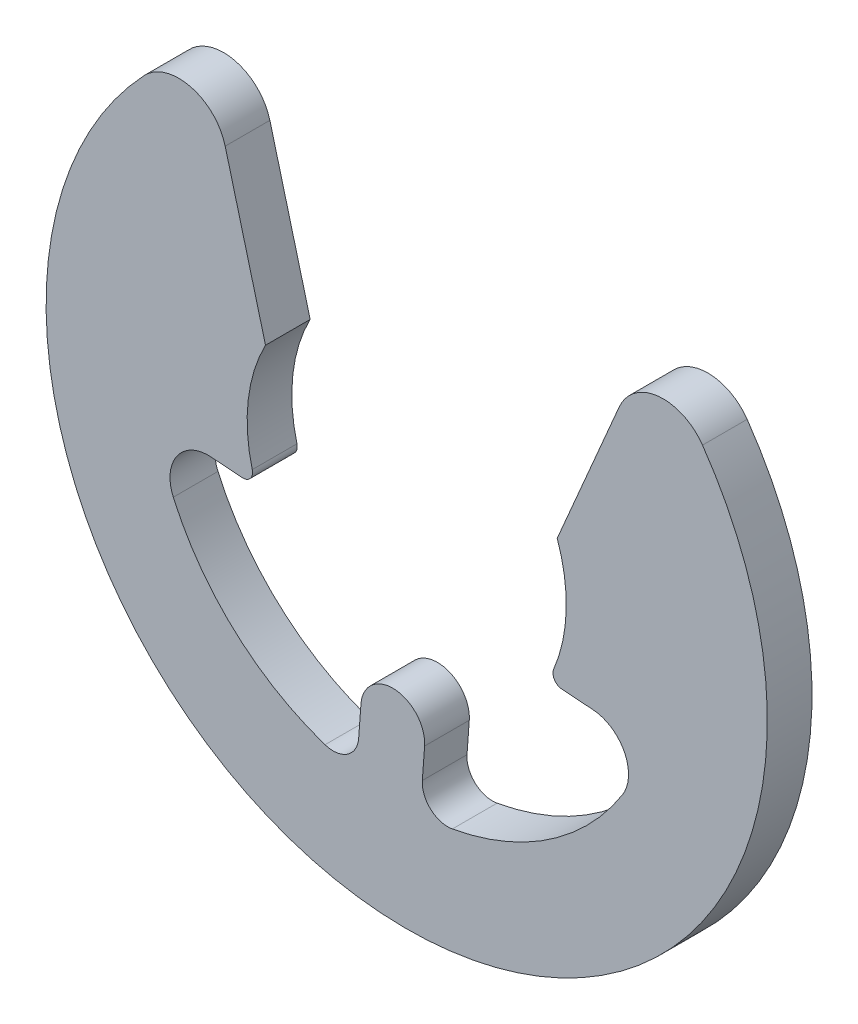
ISO-10303-21;
HEADER;
FILE_DESCRIPTION(('STEP AP214'),'2;1');
FILE_NAME('part.step','',(''),(''),'','','');
FILE_SCHEMA(('AUTOMOTIVE_DESIGN { 1 0 10303 214 1 1 1 1 }'));
ENDSEC;
DATA;
#1=APPLICATION_CONTEXT('core data for automotive mechanical design processes');
#2=APPLICATION_PROTOCOL_DEFINITION('international standard','automotive_design',2000,#1);
#3=PRODUCT_CONTEXT('',#1,'mechanical');
#4=PRODUCT('Part','Part','',(#3));
#5=PRODUCT_RELATED_PRODUCT_CATEGORY('part','',(#4));
#6=PRODUCT_DEFINITION_FORMATION('','',#4);
#7=PRODUCT_DEFINITION_CONTEXT('part definition',#1,'design');
#8=PRODUCT_DEFINITION('design','',#6,#7);
#9=PRODUCT_DEFINITION_SHAPE('','',#8);
#10=(LENGTH_UNIT() NAMED_UNIT(*) SI_UNIT(.MILLI.,.METRE.));
#11=(NAMED_UNIT(*) PLANE_ANGLE_UNIT() SI_UNIT($,.RADIAN.));
#12=(NAMED_UNIT(*) SI_UNIT($,.STERADIAN.) SOLID_ANGLE_UNIT());
#13=UNCERTAINTY_MEASURE_WITH_UNIT(LENGTH_MEASURE(1.E-05),#10,'distance_accuracy_value','');
#14=(GEOMETRIC_REPRESENTATION_CONTEXT(3) GLOBAL_UNCERTAINTY_ASSIGNED_CONTEXT((#13)) GLOBAL_UNIT_ASSIGNED_CONTEXT((#10,
#11,#12)) REPRESENTATION_CONTEXT('',''));
#15=CARTESIAN_POINT('',(0.,0.,0.));
#16=DIRECTION('',(0.,0.,1.));
#17=DIRECTION('',(1.,0.,0.));
#18=AXIS2_PLACEMENT_3D('',#15,#16,#17);
#19=CARTESIAN_POINT('',(-0.0874417235941766,5.80301523383279,-4.84999999999999));
#20=DIRECTION('',(0.,0.,1.));
#21=DIRECTION('',(0.,-1.,0.));
#22=AXIS2_PLACEMENT_3D('',#19,#20,#21);
#23=PLANE('',#22);
#24=CARTESIAN_POINT('',(0.,7.,-4.84999999999999));
#25=DIRECTION('',(0.,0.,1.));
#26=DIRECTION('',(0.,-1.,0.));
#27=AXIS2_PLACEMENT_3D('',#24,#25,#26);
#28=CIRCLE('',#27,2.5);
#29=CARTESIAN_POINT('',(-2.420036172523,6.37276406059581,-4.84999999999999));
#30=VERTEX_POINT('',#29);
#31=CARTESIAN_POINT('',(-2.21234091420949,8.16427989732485,-4.85));
#32=VERTEX_POINT('',#31);
#33=EDGE_CURVE('E175',#30,#32,#28,.F.);
#34=ORIENTED_EDGE('',*,*,#33,.T.);
#35=DIRECTION('',(-0.256010902711158,0.966673894182013,0.));
#36=VECTOR('',#35,1.);
#37=CARTESIAN_POINT('',(-2.84401048965368,10.5494067878771,-4.85));
#38=LINE('',#37,#36);
#39=CARTESIAN_POINT('',(-2.84401048965367,10.5494067878771,-4.85));
#40=VERTEX_POINT('',#39);
#41=EDGE_CURVE('E156',#40,#32,#38,.F.);
#42=ORIENTED_EDGE('',*,*,#41,.F.);
#43=CARTESIAN_POINT('',(-3.56901591029018,10.3573986108437,-4.85));
#44=DIRECTION('',(0.,0.,1.));
#45=DIRECTION('',(1.,0.,0.));
#46=AXIS2_PLACEMENT_3D('',#43,#44,#45);
#47=CIRCLE('',#46,0.750000000000001);
#48=CARTESIAN_POINT('',(-4.11529385574276,10.8712861533198,-4.85));
#49=VERTEX_POINT('',#48);
#50=EDGE_CURVE('E19',#40,#49,#47,.T.);
#51=ORIENTED_EDGE('',*,*,#50,.T.);
#52=CARTESIAN_POINT('',(0.,7.,-4.84999999999999));
#53=DIRECTION('',(0.,0.,1.));
#54=DIRECTION('',(0.,-1.,0.));
#55=AXIS2_PLACEMENT_3D('',#52,#53,#54);
#56=CIRCLE('',#55,5.65);
#57=CARTESIAN_POINT('',(4.63420949373596,10.2321204136244,-4.84999999999999));
#58=VERTEX_POINT('',#57);
#59=EDGE_CURVE('E154',#58,#49,#56,.F.);
#60=ORIENTED_EDGE('',*,*,#59,.F.);
#61=CARTESIAN_POINT('',(4.01904894147012,9.80307788084239,-4.84999999999999));
#62=DIRECTION('',(0.,0.,1.));
#63=DIRECTION('',(1.,0.,0.));
#64=AXIS2_PLACEMENT_3D('',#61,#62,#63);
#65=CIRCLE('',#64,0.750000000000001);
#66=CARTESIAN_POINT('',(3.32964461399444,10.0984110372231,-4.84999999999999));
#67=VERTEX_POINT('',#66);
#68=EDGE_CURVE('E163',#67,#58,#65,.F.);
#69=ORIENTED_EDGE('',*,*,#68,.F.);
#70=DIRECTION('',(-0.393777541840974,-0.919205769967574,0.));
#71=VECTOR('',#70,1.);
#72=CARTESIAN_POINT('',(2.3580559431995,7.83040482220513,-4.84999999999999));
#73=LINE('',#72,#71);
#74=CARTESIAN_POINT('',(2.3580559431995,7.83040482220513,-4.84999999999999));
#75=VERTEX_POINT('',#74);
#76=EDGE_CURVE('E227',#75,#67,#73,.F.);
#77=ORIENTED_EDGE('',*,*,#76,.F.);
#78=CARTESIAN_POINT('',(0.,7.,-4.84999999999999));
#79=DIRECTION('',(0.,0.,1.));
#80=DIRECTION('',(0.,-1.,0.));
#81=AXIS2_PLACEMENT_3D('',#78,#79,#80);
#82=CIRCLE('',#81,2.5);
#83=CARTESIAN_POINT('',(2.30318921531402,6.02772460770561,-4.84999999999999));
#84=VERTEX_POINT('',#83);
#85=EDGE_CURVE('E224',#75,#84,#82,.F.);
#86=ORIENTED_EDGE('',*,*,#85,.T.);
#87=CARTESIAN_POINT('',(2.44138056823286,5.96938808416795,-4.84999999999999));
#88=DIRECTION('',(0.,0.,1.));
#89=DIRECTION('',(1.,0.,0.));
#90=AXIS2_PLACEMENT_3D('',#87,#88,#89);
#91=CIRCLE('',#90,0.15);
#92=CARTESIAN_POINT('',(2.43045194105861,5.8197867302032,-4.84999999999999));
#93=VERTEX_POINT('',#92);
#94=EDGE_CURVE('E220',#93,#84,#91,.F.);
#95=ORIENTED_EDGE('',*,*,#94,.F.);
#96=DIRECTION('',(0.997342359764995,-0.0728575144950101,0.));
#97=VECTOR('',#96,1.);
#98=CARTESIAN_POINT('',(2.91916956479998,5.78408509674997,-4.84999999999999));
#99=LINE('',#98,#97);
#100=CARTESIAN_POINT('',(2.91916956479998,5.78408509674997,-4.84999999999999));
#101=VERTEX_POINT('',#100);
#102=EDGE_CURVE('E217',#101,#93,#99,.F.);
#103=ORIENTED_EDGE('',*,*,#102,.F.);
#104=CARTESIAN_POINT('',(2.87545505610297,5.18567968089097,-4.84999999999999));
#105=DIRECTION('',(0.,0.,1.));
#106=DIRECTION('',(1.,0.,0.));
#107=AXIS2_PLACEMENT_3D('',#104,#105,#106);
#108=CIRCLE('',#107,0.6);
#109=CARTESIAN_POINT('',(3.38288830129761,4.86550550693056,-4.84999999999999));
#110=VERTEX_POINT('',#109);
#111=EDGE_CURVE('E214',#101,#110,#108,.F.);
#112=ORIENTED_EDGE('',*,*,#111,.T.);
#113=CARTESIAN_POINT('',(0.,7.,-4.84999999999999));
#114=DIRECTION('',(0.,0.,1.));
#115=DIRECTION('',(0.,-1.,0.));
#116=AXIS2_PLACEMENT_3D('',#113,#114,#115);
#117=CIRCLE('',#116,4.);
#118=CARTESIAN_POINT('',(0.715166419479756,3.06445213566796,-4.84999999999999));
#119=VERTEX_POINT('',#118);
#120=EDGE_CURVE('E210',#110,#119,#117,.F.);
#121=ORIENTED_EDGE('',*,*,#120,.T.);
#122=CARTESIAN_POINT('',(0.64364977753178,3.45800692210116,-4.84999999999999));
#123=DIRECTION('',(0.,0.,1.));
#124=DIRECTION('',(1.,0.,0.));
#125=AXIS2_PLACEMENT_3D('',#122,#123,#124);
#126=CIRCLE('',#125,0.4);
#127=CARTESIAN_POINT('',(0.244712833625782,3.48714992789916,-4.84999999999999));
#128=VERTEX_POINT('',#127);
#129=EDGE_CURVE('E206',#119,#128,#126,.F.);
#130=ORIENTED_EDGE('',*,*,#129,.T.);
#131=DIRECTION('',(0.0728575144950101,0.997342359764995,0.));
#132=VECTOR('',#131,1.);
#133=CARTESIAN_POINT('',(0.280098636397467,3.9715441634575,-4.84999999999999));
#134=LINE('',#133,#132);
#135=CARTESIAN_POINT('',(0.280098636397467,3.97154416345751,-4.84999999999999));
#136=VERTEX_POINT('',#135);
#137=EDGE_CURVE('E202',#136,#128,#134,.F.);
#138=ORIENTED_EDGE('',*,*,#137,.F.);
#139=CARTESIAN_POINT('',(-0.218572543485031,4.00797292070501,-4.84999999999999));
#140=DIRECTION('',(0.,0.,1.));
#141=DIRECTION('',(1.,0.,0.));
#142=AXIS2_PLACEMENT_3D('',#139,#140,#141);
#143=CIRCLE('',#142,0.5);
#144=CARTESIAN_POINT('',(-0.717243723367528,4.04440167795252,-4.84999999999999));
#145=VERTEX_POINT('',#144);
#146=EDGE_CURVE('E199',#145,#136,#143,.F.);
#147=ORIENTED_EDGE('',*,*,#146,.F.);
#148=DIRECTION('',(-0.0728575144950101,-0.997342359764995,0.));
#149=VECTOR('',#148,1.);
#150=CARTESIAN_POINT('',(-0.752629526139214,3.56000744239417,-4.84999999999999));
#151=LINE('',#150,#149);
#152=CARTESIAN_POINT('',(-0.752629526139213,3.56000744239417,-4.84999999999999));
#153=VERTEX_POINT('',#152);
#154=EDGE_CURVE('E196',#153,#145,#151,.F.);
#155=ORIENTED_EDGE('',*,*,#154,.F.);
#156=CARTESIAN_POINT('',(-1.15156647004521,3.58915044819218,-4.84999999999999));
#157=DIRECTION('',(0.,0.,1.));
#158=DIRECTION('',(1.,0.,0.));
#159=AXIS2_PLACEMENT_3D('',#156,#157,#158);
#160=CIRCLE('',#159,0.4);
#161=CARTESIAN_POINT('',(-1.27951830005023,3.21016716465798,-4.84999999999999));
#162=VERTEX_POINT('',#161);
#163=EDGE_CURVE('E193',#153,#162,#160,.F.);
#164=ORIENTED_EDGE('',*,*,#163,.T.);
#165=CARTESIAN_POINT('',(0.,7.,-4.84999999999999));
#166=DIRECTION('',(0.,0.,1.));
#167=DIRECTION('',(0.,-1.,0.));
#168=AXIS2_PLACEMENT_3D('',#165,#166,#167);
#169=CIRCLE('',#168,4.);
#170=CARTESIAN_POINT('',(-3.65717541469059,5.37979384454239,-4.84999999999999));
#171=VERTEX_POINT('',#170);
#172=EDGE_CURVE('E189',#162,#171,#169,.F.);
#173=ORIENTED_EDGE('',*,*,#172,.T.);
#174=CARTESIAN_POINT('',(-3.108599102487,5.62282476786103,-4.84999999999999));
#175=DIRECTION('',(0.,0.,1.));
#176=DIRECTION('',(1.,0.,0.));
#177=AXIS2_PLACEMENT_3D('',#174,#175,#176);
#178=CIRCLE('',#177,0.6);
#179=CARTESIAN_POINT('',(-3.06488459379,6.22123018372003,-4.84999999999999));
#180=VERTEX_POINT('',#179);
#181=EDGE_CURVE('E185',#171,#180,#178,.F.);
#182=ORIENTED_EDGE('',*,*,#181,.T.);
#183=DIRECTION('',(0.997342359764995,-0.0728575144950101,0.));
#184=VECTOR('',#183,1.);
#185=CARTESIAN_POINT('',(-2.57616697004863,6.18552855026681,-4.84999999999999));
#186=LINE('',#185,#184);
#187=CARTESIAN_POINT('',(-2.57616697004862,6.18552855026681,-4.84999999999999));
#188=VERTEX_POINT('',#187);
#189=EDGE_CURVE('E181',#188,#180,#186,.F.);
#190=ORIENTED_EDGE('',*,*,#189,.F.);
#191=CARTESIAN_POINT('',(-2.56523834287437,6.33512990423156,-4.84999999999999));
#192=DIRECTION('',(0.,0.,1.));
#193=DIRECTION('',(1.,0.,0.));
#194=AXIS2_PLACEMENT_3D('',#191,#192,#193);
#195=CIRCLE('',#194,0.15);
#196=EDGE_CURVE('E178',#30,#188,#195,.F.);
#197=ORIENTED_EDGE('',*,*,#196,.F.);
#198=EDGE_LOOP('',(#34,#42,#51,#60,#69,#77,#86,#95,#103,#112,#121,#130,#138,#147,#155,#164,#173,
#182,#190,#197));
#199=FACE_BOUND('',#198,.T.);
#200=ADVANCED_FACE('F16',(#199),#23,.T.);
#201=CARTESIAN_POINT('',(0.,7.,-5.54999999999999));
#202=DIRECTION('',(0.,0.,1.));
#203=DIRECTION('',(0.,-1.,0.));
#204=AXIS2_PLACEMENT_3D('',#201,#202,#203);
#205=CYLINDRICAL_SURFACE('',#204,5.65);
#206=DIRECTION('',(0.,0.,1.));
#207=VECTOR('',#206,1.);
#208=CARTESIAN_POINT('',(4.63420949373595,10.2321204136244,-5.54999999999999));
#209=LINE('',#208,#207);
#210=CARTESIAN_POINT('',(4.63420949373596,10.2321204136244,-5.54999999999999));
#211=VERTEX_POINT('',#210);
#212=EDGE_CURVE('E162',#58,#211,#209,.F.);
#213=ORIENTED_EDGE('',*,*,#212,.F.);
#214=ORIENTED_EDGE('',*,*,#59,.T.);
#215=DIRECTION('',(0.,0.,1.));
#216=VECTOR('',#215,1.);
#217=CARTESIAN_POINT('',(-4.11529385574276,10.8712861533198,-5.54999999999999));
#218=LINE('',#217,#216);
#219=CARTESIAN_POINT('',(-4.11529385574277,10.8712861533198,-5.54999999999999));
#220=VERTEX_POINT('',#219);
#221=EDGE_CURVE('E161',#220,#49,#218,.T.);
#222=ORIENTED_EDGE('',*,*,#221,.F.);
#223=CARTESIAN_POINT('',(0.,7.,-5.54999999999999));
#224=DIRECTION('',(0.,0.,1.));
#225=DIRECTION('',(0.,-1.,0.));
#226=AXIS2_PLACEMENT_3D('',#223,#224,#225);
#227=CIRCLE('',#226,5.65);
#228=EDGE_CURVE('E167',#220,#211,#227,.T.);
#229=ORIENTED_EDGE('',*,*,#228,.T.);
#230=EDGE_LOOP('',(#213,#214,#222,#229));
#231=FACE_BOUND('',#230,.T.);
#232=ADVANCED_FACE('F159',(#231),#205,.T.);
#233=CARTESIAN_POINT('',(4.01904894147012,9.80307788084239,-5.54999999999999));
#234=DIRECTION('',(0.,0.,1.));
#235=DIRECTION('',(1.,0.,0.));
#236=AXIS2_PLACEMENT_3D('',#233,#234,#235);
#237=CYLINDRICAL_SURFACE('',#236,0.750000000000001);
#238=ORIENTED_EDGE('',*,*,#68,.T.);
#239=ORIENTED_EDGE('',*,*,#212,.T.);
#240=CARTESIAN_POINT('',(4.01904894147012,9.80307788084239,-5.54999999999999));
#241=DIRECTION('',(0.,0.,1.));
#242=DIRECTION('',(1.,0.,0.));
#243=AXIS2_PLACEMENT_3D('',#240,#241,#242);
#244=CIRCLE('',#243,0.750000000000001);
#245=CARTESIAN_POINT('',(3.32964461399444,10.0984110372231,-5.54999999999999));
#246=VERTEX_POINT('',#245);
#247=EDGE_CURVE('E273',#211,#246,#244,.T.);
#248=ORIENTED_EDGE('',*,*,#247,.T.);
#249=DIRECTION('',(0.,0.,1.));
#250=VECTOR('',#249,1.);
#251=CARTESIAN_POINT('',(3.32964461399444,10.0984110372231,-5.54999999999999));
#252=LINE('',#251,#250);
#253=EDGE_CURVE('E225',#67,#246,#252,.F.);
#254=ORIENTED_EDGE('',*,*,#253,.F.);
#255=EDGE_LOOP('',(#238,#239,#248,#254));
#256=FACE_BOUND('',#255,.T.);
#257=ADVANCED_FACE('F297',(#256),#237,.T.);
#258=CARTESIAN_POINT('',(2.3580559431995,7.83040482220513,-5.54999999999999));
#259=DIRECTION('',(-0.919205769967574,0.393777541840974,0.));
#260=DIRECTION('',(-0.393777541840974,-0.919205769967574,0.));
#261=AXIS2_PLACEMENT_3D('',#258,#259,#260);
#262=PLANE('',#261);
#263=ORIENTED_EDGE('',*,*,#76,.T.);
#264=ORIENTED_EDGE('',*,*,#253,.T.);
#265=DIRECTION('',(-0.393777541840976,-0.919205769967573,0.));
#266=VECTOR('',#265,1.);
#267=CARTESIAN_POINT('',(3.32964461399444,10.0984110372231,-5.54999999999999));
#268=LINE('',#267,#266);
#269=CARTESIAN_POINT('',(2.3580559431995,7.83040482220513,-5.54999999999999));
#270=VERTEX_POINT('',#269);
#271=EDGE_CURVE('E272',#246,#270,#268,.T.);
#272=ORIENTED_EDGE('',*,*,#271,.T.);
#273=DIRECTION('',(0.,0.,1.));
#274=VECTOR('',#273,1.);
#275=CARTESIAN_POINT('',(2.3580559431995,7.83040482220513,-5.54999999999999));
#276=LINE('',#275,#274);
#277=EDGE_CURVE('E221',#270,#75,#276,.T.);
#278=ORIENTED_EDGE('',*,*,#277,.T.);
#279=EDGE_LOOP('',(#263,#264,#272,#278));
#280=FACE_BOUND('',#279,.T.);
#281=ADVANCED_FACE('F304',(#280),#262,.T.);
#282=CARTESIAN_POINT('',(0.,7.,-5.54999999999999));
#283=DIRECTION('',(0.,0.,1.));
#284=DIRECTION('',(0.,-1.,0.));
#285=AXIS2_PLACEMENT_3D('',#282,#283,#284);
#286=CYLINDRICAL_SURFACE('',#285,2.5);
#287=CARTESIAN_POINT('',(0.,7.,-5.54999999999999));
#288=DIRECTION('',(0.,0.,1.));
#289=DIRECTION('',(0.,-1.,0.));
#290=AXIS2_PLACEMENT_3D('',#287,#288,#289);
#291=CIRCLE('',#290,2.5);
#292=CARTESIAN_POINT('',(2.30318921531402,6.02772460770561,-5.54999999999999));
#293=VERTEX_POINT('',#292);
#294=EDGE_CURVE('E269',#270,#293,#291,.F.);
#295=ORIENTED_EDGE('',*,*,#294,.T.);
#296=DIRECTION('',(0.,0.,1.));
#297=VECTOR('',#296,1.);
#298=CARTESIAN_POINT('',(2.30318921531402,6.02772460770561,-5.54999999999999));
#299=LINE('',#298,#297);
#300=EDGE_CURVE('E218',#84,#293,#299,.F.);
#301=ORIENTED_EDGE('',*,*,#300,.F.);
#302=ORIENTED_EDGE('',*,*,#85,.F.);
#303=ORIENTED_EDGE('',*,*,#277,.F.);
#304=EDGE_LOOP('',(#295,#301,#302,#303));
#305=FACE_BOUND('',#304,.T.);
#306=ADVANCED_FACE('F308',(#305),#286,.F.);
#307=CARTESIAN_POINT('',(2.44138056823286,5.96938808416795,-5.54999999999999));
#308=DIRECTION('',(0.,0.,1.));
#309=DIRECTION('',(1.,0.,0.));
#310=AXIS2_PLACEMENT_3D('',#307,#308,#309);
#311=CYLINDRICAL_SURFACE('',#310,0.15);
#312=ORIENTED_EDGE('',*,*,#94,.T.);
#313=ORIENTED_EDGE('',*,*,#300,.T.);
#314=CARTESIAN_POINT('',(2.44138056823286,5.96938808416795,-5.54999999999999));
#315=DIRECTION('',(0.,0.,1.));
#316=DIRECTION('',(1.,0.,0.));
#317=AXIS2_PLACEMENT_3D('',#314,#315,#316);
#318=CIRCLE('',#317,0.15);
#319=CARTESIAN_POINT('',(2.43045194105861,5.8197867302032,-5.54999999999999));
#320=VERTEX_POINT('',#319);
#321=EDGE_CURVE('E266',#293,#320,#318,.T.);
#322=ORIENTED_EDGE('',*,*,#321,.T.);
#323=DIRECTION('',(0.,0.,1.));
#324=VECTOR('',#323,1.);
#325=CARTESIAN_POINT('',(2.4304519410586,5.8197867302032,-5.54999999999999));
#326=LINE('',#325,#324);
#327=EDGE_CURVE('E215',#93,#320,#326,.F.);
#328=ORIENTED_EDGE('',*,*,#327,.F.);
#329=EDGE_LOOP('',(#312,#313,#322,#328));
#330=FACE_BOUND('',#329,.T.);
#331=ADVANCED_FACE('F318',(#330),#311,.T.);
#332=CARTESIAN_POINT('',(2.91916956479998,5.78408509674997,-5.54999999999999));
#333=DIRECTION('',(-0.0728575144950101,-0.997342359764995,0.));
#334=DIRECTION('',(0.997342359764995,-0.0728575144950101,0.));
#335=AXIS2_PLACEMENT_3D('',#332,#333,#334);
#336=PLANE('',#335);
#337=ORIENTED_EDGE('',*,*,#102,.T.);
#338=ORIENTED_EDGE('',*,*,#327,.T.);
#339=DIRECTION('',(0.997342359764995,-0.0728575144950151,0.));
#340=VECTOR('',#339,1.);
#341=CARTESIAN_POINT('',(2.4304519410586,5.8197867302032,-5.54999999999999));
#342=LINE('',#341,#340);
#343=CARTESIAN_POINT('',(2.91916956479998,5.78408509674997,-5.54999999999999));
#344=VERTEX_POINT('',#343);
#345=EDGE_CURVE('E265',#320,#344,#342,.T.);
#346=ORIENTED_EDGE('',*,*,#345,.T.);
#347=DIRECTION('',(0.,0.,1.));
#348=VECTOR('',#347,1.);
#349=CARTESIAN_POINT('',(2.91916956479998,5.78408509674997,-5.54999999999999));
#350=LINE('',#349,#348);
#351=EDGE_CURVE('E211',#344,#101,#350,.T.);
#352=ORIENTED_EDGE('',*,*,#351,.T.);
#353=EDGE_LOOP('',(#337,#338,#346,#352));
#354=FACE_BOUND('',#353,.T.);
#355=ADVANCED_FACE('F321',(#354),#336,.T.);
#356=CARTESIAN_POINT('',(2.87545505610297,5.18567968089097,-5.54999999999999));
#357=DIRECTION('',(0.,0.,1.));
#358=DIRECTION('',(1.,0.,0.));
#359=AXIS2_PLACEMENT_3D('',#356,#357,#358);
#360=CYLINDRICAL_SURFACE('',#359,0.6);
#361=CARTESIAN_POINT('',(2.87545505610297,5.18567968089097,-5.54999999999999));
#362=DIRECTION('',(0.,0.,1.));
#363=DIRECTION('',(1.,0.,0.));
#364=AXIS2_PLACEMENT_3D('',#361,#362,#363);
#365=CIRCLE('',#364,0.6);
#366=CARTESIAN_POINT('',(3.38288830129761,4.86550550693056,-5.54999999999999));
#367=VERTEX_POINT('',#366);
#368=EDGE_CURVE('E262',#344,#367,#365,.F.);
#369=ORIENTED_EDGE('',*,*,#368,.T.);
#370=DIRECTION('',(0.,0.,1.));
#371=VECTOR('',#370,1.);
#372=CARTESIAN_POINT('',(3.38288830129761,4.86550550693056,-5.54999999999999));
#373=LINE('',#372,#371);
#374=EDGE_CURVE('E207',#367,#110,#373,.T.);
#375=ORIENTED_EDGE('',*,*,#374,.T.);
#376=ORIENTED_EDGE('',*,*,#111,.F.);
#377=ORIENTED_EDGE('',*,*,#351,.F.);
#378=EDGE_LOOP('',(#369,#375,#376,#377));
#379=FACE_BOUND('',#378,.T.);
#380=ADVANCED_FACE('F323',(#379),#360,.F.);
#381=CARTESIAN_POINT('',(0.,7.,-5.54999999999999));
#382=DIRECTION('',(0.,0.,1.));
#383=DIRECTION('',(0.,-1.,0.));
#384=AXIS2_PLACEMENT_3D('',#381,#382,#383);
#385=CYLINDRICAL_SURFACE('',#384,4.);
#386=CARTESIAN_POINT('',(0.,7.,-5.54999999999999));
#387=DIRECTION('',(0.,0.,1.));
#388=DIRECTION('',(0.,-1.,0.));
#389=AXIS2_PLACEMENT_3D('',#386,#387,#388);
#390=CIRCLE('',#389,4.);
#391=CARTESIAN_POINT('',(0.715166419479756,3.06445213566796,-5.54999999999999));
#392=VERTEX_POINT('',#391);
#393=EDGE_CURVE('E259',#367,#392,#390,.F.);
#394=ORIENTED_EDGE('',*,*,#393,.T.);
#395=DIRECTION('',(0.,0.,1.));
#396=VECTOR('',#395,1.);
#397=CARTESIAN_POINT('',(0.715166419479755,3.06445213566796,-5.54999999999999));
#398=LINE('',#397,#396);
#399=EDGE_CURVE('E203',#392,#119,#398,.T.);
#400=ORIENTED_EDGE('',*,*,#399,.T.);
#401=ORIENTED_EDGE('',*,*,#120,.F.);
#402=ORIENTED_EDGE('',*,*,#374,.F.);
#403=EDGE_LOOP('',(#394,#400,#401,#402));
#404=FACE_BOUND('',#403,.T.);
#405=ADVANCED_FACE('F328',(#404),#385,.F.);
#406=CARTESIAN_POINT('',(0.64364977753178,3.45800692210116,-5.54999999999999));
#407=DIRECTION('',(0.,0.,1.));
#408=DIRECTION('',(1.,0.,0.));
#409=AXIS2_PLACEMENT_3D('',#406,#407,#408);
#410=CYLINDRICAL_SURFACE('',#409,0.4);
#411=CARTESIAN_POINT('',(0.64364977753178,3.45800692210116,-5.54999999999999));
#412=DIRECTION('',(0.,0.,1.));
#413=DIRECTION('',(1.,0.,0.));
#414=AXIS2_PLACEMENT_3D('',#411,#412,#413);
#415=CIRCLE('',#414,0.4);
#416=CARTESIAN_POINT('',(0.244712833625782,3.48714992789916,-5.54999999999999));
#417=VERTEX_POINT('',#416);
#418=EDGE_CURVE('E256',#392,#417,#415,.F.);
#419=ORIENTED_EDGE('',*,*,#418,.T.);
#420=DIRECTION('',(0.,0.,1.));
#421=VECTOR('',#420,1.);
#422=CARTESIAN_POINT('',(0.244712833625782,3.48714992789916,-5.54999999999999));
#423=LINE('',#422,#421);
#424=EDGE_CURVE('E200',#128,#417,#423,.F.);
#425=ORIENTED_EDGE('',*,*,#424,.F.);
#426=ORIENTED_EDGE('',*,*,#129,.F.);
#427=ORIENTED_EDGE('',*,*,#399,.F.);
#428=EDGE_LOOP('',(#419,#425,#426,#427));
#429=FACE_BOUND('',#428,.T.);
#430=ADVANCED_FACE('F334',(#429),#410,.F.);
#431=CARTESIAN_POINT('',(0.280098636397467,3.9715441634575,-5.54999999999999));
#432=DIRECTION('',(0.997342359764995,-0.0728575144950101,0.));
#433=DIRECTION('',(0.0728575144950101,0.997342359764995,0.));
#434=AXIS2_PLACEMENT_3D('',#431,#432,#433);
#435=PLANE('',#434);
#436=ORIENTED_EDGE('',*,*,#137,.T.);
#437=ORIENTED_EDGE('',*,*,#424,.T.);
#438=DIRECTION('',(0.0728575144950095,0.997342359764995,0.));
#439=VECTOR('',#438,1.);
#440=CARTESIAN_POINT('',(0.244712833625782,3.48714992789916,-5.54999999999999));
#441=LINE('',#440,#439);
#442=CARTESIAN_POINT('',(0.280098636397467,3.97154416345751,-5.54999999999999));
#443=VERTEX_POINT('',#442);
#444=EDGE_CURVE('E255',#417,#443,#441,.T.);
#445=ORIENTED_EDGE('',*,*,#444,.T.);
#446=DIRECTION('',(0.,0.,1.));
#447=VECTOR('',#446,1.);
#448=CARTESIAN_POINT('',(0.280098636397466,3.97154416345751,-5.54999999999999));
#449=LINE('',#448,#447);
#450=EDGE_CURVE('E197',#136,#443,#449,.F.);
#451=ORIENTED_EDGE('',*,*,#450,.F.);
#452=EDGE_LOOP('',(#436,#437,#445,#451));
#453=FACE_BOUND('',#452,.T.);
#454=ADVANCED_FACE('F337',(#453),#435,.T.);
#455=CARTESIAN_POINT('',(-0.218572543485031,4.00797292070501,-5.54999999999999));
#456=DIRECTION('',(0.,0.,1.));
#457=DIRECTION('',(1.,0.,0.));
#458=AXIS2_PLACEMENT_3D('',#455,#456,#457);
#459=CYLINDRICAL_SURFACE('',#458,0.5);
#460=ORIENTED_EDGE('',*,*,#146,.T.);
#461=ORIENTED_EDGE('',*,*,#450,.T.);
#462=CARTESIAN_POINT('',(-0.218572543485031,4.00797292070501,-5.54999999999999));
#463=DIRECTION('',(0.,0.,1.));
#464=DIRECTION('',(1.,0.,0.));
#465=AXIS2_PLACEMENT_3D('',#462,#463,#464);
#466=CIRCLE('',#465,0.5);
#467=CARTESIAN_POINT('',(-0.717243723367528,4.04440167795252,-5.54999999999999));
#468=VERTEX_POINT('',#467);
#469=EDGE_CURVE('E252',#443,#468,#466,.T.);
#470=ORIENTED_EDGE('',*,*,#469,.T.);
#471=DIRECTION('',(0.,0.,1.));
#472=VECTOR('',#471,1.);
#473=CARTESIAN_POINT('',(-0.717243723367528,4.04440167795252,-5.54999999999999));
#474=LINE('',#473,#472);
#475=EDGE_CURVE('E194',#145,#468,#474,.F.);
#476=ORIENTED_EDGE('',*,*,#475,.F.);
#477=EDGE_LOOP('',(#460,#461,#470,#476));
#478=FACE_BOUND('',#477,.T.);
#479=ADVANCED_FACE('F378',(#478),#459,.T.);
#480=CARTESIAN_POINT('',(-0.752629526139214,3.56000744239417,-5.54999999999999));
#481=DIRECTION('',(-0.997342359764995,0.0728575144950101,0.));
#482=DIRECTION('',(-0.0728575144950101,-0.997342359764995,0.));
#483=AXIS2_PLACEMENT_3D('',#480,#481,#482);
#484=PLANE('',#483);
#485=ORIENTED_EDGE('',*,*,#154,.T.);
#486=ORIENTED_EDGE('',*,*,#475,.T.);
#487=DIRECTION('',(-0.0728575144950088,-0.997342359764995,0.));
#488=VECTOR('',#487,1.);
#489=CARTESIAN_POINT('',(-0.717243723367528,4.04440167795252,-5.54999999999999));
#490=LINE('',#489,#488);
#491=CARTESIAN_POINT('',(-0.752629526139213,3.56000744239417,-5.54999999999999));
#492=VERTEX_POINT('',#491);
#493=EDGE_CURVE('E251',#468,#492,#490,.T.);
#494=ORIENTED_EDGE('',*,*,#493,.T.);
#495=DIRECTION('',(0.,0.,1.));
#496=VECTOR('',#495,1.);
#497=CARTESIAN_POINT('',(-0.752629526139212,3.56000744239417,-5.54999999999999));
#498=LINE('',#497,#496);
#499=EDGE_CURVE('E190',#492,#153,#498,.T.);
#500=ORIENTED_EDGE('',*,*,#499,.T.);
#501=EDGE_LOOP('',(#485,#486,#494,#500));
#502=FACE_BOUND('',#501,.T.);
#503=ADVANCED_FACE('F375',(#502),#484,.T.);
#504=CARTESIAN_POINT('',(-1.15156647004521,3.58915044819218,-5.54999999999999));
#505=DIRECTION('',(0.,0.,1.));
#506=DIRECTION('',(1.,0.,0.));
#507=AXIS2_PLACEMENT_3D('',#504,#505,#506);
#508=CYLINDRICAL_SURFACE('',#507,0.4);
#509=CARTESIAN_POINT('',(-1.15156647004521,3.58915044819218,-5.54999999999999));
#510=DIRECTION('',(0.,0.,1.));
#511=DIRECTION('',(1.,0.,0.));
#512=AXIS2_PLACEMENT_3D('',#509,#510,#511);
#513=CIRCLE('',#512,0.4);
#514=CARTESIAN_POINT('',(-1.27951830005023,3.21016716465798,-5.54999999999999));
#515=VERTEX_POINT('',#514);
#516=EDGE_CURVE('E248',#492,#515,#513,.F.);
#517=ORIENTED_EDGE('',*,*,#516,.T.);
#518=DIRECTION('',(0.,0.,1.));
#519=VECTOR('',#518,1.);
#520=CARTESIAN_POINT('',(-1.27951830005024,3.21016716465798,-5.54999999999999));
#521=LINE('',#520,#519);
#522=EDGE_CURVE('E186',#515,#162,#521,.T.);
#523=ORIENTED_EDGE('',*,*,#522,.T.);
#524=ORIENTED_EDGE('',*,*,#163,.F.);
#525=ORIENTED_EDGE('',*,*,#499,.F.);
#526=EDGE_LOOP('',(#517,#523,#524,#525));
#527=FACE_BOUND('',#526,.T.);
#528=ADVANCED_FACE('F372',(#527),#508,.F.);
#529=CARTESIAN_POINT('',(0.,7.,-5.54999999999999));
#530=DIRECTION('',(0.,0.,1.));
#531=DIRECTION('',(0.,-1.,0.));
#532=AXIS2_PLACEMENT_3D('',#529,#530,#531);
#533=CYLINDRICAL_SURFACE('',#532,4.);
#534=CARTESIAN_POINT('',(0.,7.,-5.54999999999999));
#535=DIRECTION('',(0.,0.,1.));
#536=DIRECTION('',(0.,-1.,0.));
#537=AXIS2_PLACEMENT_3D('',#534,#535,#536);
#538=CIRCLE('',#537,4.);
#539=CARTESIAN_POINT('',(-3.65717541469059,5.37979384454239,-5.54999999999999));
#540=VERTEX_POINT('',#539);
#541=EDGE_CURVE('E245',#515,#540,#538,.F.);
#542=ORIENTED_EDGE('',*,*,#541,.T.);
#543=DIRECTION('',(0.,0.,1.));
#544=VECTOR('',#543,1.);
#545=CARTESIAN_POINT('',(-3.65717541469059,5.37979384454239,-5.54999999999999));
#546=LINE('',#545,#544);
#547=EDGE_CURVE('E182',#540,#171,#546,.T.);
#548=ORIENTED_EDGE('',*,*,#547,.T.);
#549=ORIENTED_EDGE('',*,*,#172,.F.);
#550=ORIENTED_EDGE('',*,*,#522,.F.);
#551=EDGE_LOOP('',(#542,#548,#549,#550));
#552=FACE_BOUND('',#551,.T.);
#553=ADVANCED_FACE('F370',(#552),#533,.F.);
#554=CARTESIAN_POINT('',(-3.108599102487,5.62282476786103,-5.54999999999999));
#555=DIRECTION('',(0.,0.,1.));
#556=DIRECTION('',(1.,0.,0.));
#557=AXIS2_PLACEMENT_3D('',#554,#555,#556);
#558=CYLINDRICAL_SURFACE('',#557,0.6);
#559=CARTESIAN_POINT('',(-3.108599102487,5.62282476786103,-5.54999999999999));
#560=DIRECTION('',(0.,0.,1.));
#561=DIRECTION('',(1.,0.,0.));
#562=AXIS2_PLACEMENT_3D('',#559,#560,#561);
#563=CIRCLE('',#562,0.6);
#564=CARTESIAN_POINT('',(-3.06488459379,6.22123018372003,-5.54999999999999));
#565=VERTEX_POINT('',#564);
#566=EDGE_CURVE('E242',#540,#565,#563,.F.);
#567=ORIENTED_EDGE('',*,*,#566,.T.);
#568=DIRECTION('',(0.,0.,1.));
#569=VECTOR('',#568,1.);
#570=CARTESIAN_POINT('',(-3.06488459379,6.22123018372003,-5.54999999999999));
#571=LINE('',#570,#569);
#572=EDGE_CURVE('E179',#180,#565,#571,.F.);
#573=ORIENTED_EDGE('',*,*,#572,.F.);
#574=ORIENTED_EDGE('',*,*,#181,.F.);
#575=ORIENTED_EDGE('',*,*,#547,.F.);
#576=EDGE_LOOP('',(#567,#573,#574,#575));
#577=FACE_BOUND('',#576,.T.);
#578=ADVANCED_FACE('F366',(#577),#558,.F.);
#579=CARTESIAN_POINT('',(-2.57616697004863,6.18552855026681,-5.54999999999999));
#580=DIRECTION('',(-0.0728575144950101,-0.997342359764995,0.));
#581=DIRECTION('',(0.997342359764995,-0.0728575144950101,0.));
#582=AXIS2_PLACEMENT_3D('',#579,#580,#581);
#583=PLANE('',#582);
#584=ORIENTED_EDGE('',*,*,#189,.T.);
#585=ORIENTED_EDGE('',*,*,#572,.T.);
#586=DIRECTION('',(0.997342359764996,-0.0728575144950047,0.));
#587=VECTOR('',#586,1.);
#588=CARTESIAN_POINT('',(-3.06488459379,6.22123018372003,-5.54999999999999));
#589=LINE('',#588,#587);
#590=CARTESIAN_POINT('',(-2.57616697004862,6.18552855026681,-5.54999999999999));
#591=VERTEX_POINT('',#590);
#592=EDGE_CURVE('E241',#565,#591,#589,.T.);
#593=ORIENTED_EDGE('',*,*,#592,.T.);
#594=DIRECTION('',(0.,0.,1.));
#595=VECTOR('',#594,1.);
#596=CARTESIAN_POINT('',(-2.57616697004863,6.18552855026681,-5.54999999999999));
#597=LINE('',#596,#595);
#598=EDGE_CURVE('E176',#188,#591,#597,.F.);
#599=ORIENTED_EDGE('',*,*,#598,.F.);
#600=EDGE_LOOP('',(#584,#585,#593,#599));
#601=FACE_BOUND('',#600,.T.);
#602=ADVANCED_FACE('F363',(#601),#583,.T.);
#603=CARTESIAN_POINT('',(-2.56523834287437,6.33512990423156,-5.54999999999999));
#604=DIRECTION('',(0.,0.,1.));
#605=DIRECTION('',(1.,0.,0.));
#606=AXIS2_PLACEMENT_3D('',#603,#604,#605);
#607=CYLINDRICAL_SURFACE('',#606,0.15);
#608=ORIENTED_EDGE('',*,*,#196,.T.);
#609=ORIENTED_EDGE('',*,*,#598,.T.);
#610=CARTESIAN_POINT('',(-2.56523834287437,6.33512990423156,-5.54999999999999));
#611=DIRECTION('',(0.,0.,1.));
#612=DIRECTION('',(1.,0.,0.));
#613=AXIS2_PLACEMENT_3D('',#610,#611,#612);
#614=CIRCLE('',#613,0.15);
#615=CARTESIAN_POINT('',(-2.420036172523,6.37276406059581,-5.54999999999999));
#616=VERTEX_POINT('',#615);
#617=EDGE_CURVE('E238',#591,#616,#614,.T.);
#618=ORIENTED_EDGE('',*,*,#617,.T.);
#619=DIRECTION('',(0.,0.,1.));
#620=VECTOR('',#619,1.);
#621=CARTESIAN_POINT('',(-2.420036172523,6.37276406059581,-5.54999999999999));
#622=LINE('',#621,#620);
#623=EDGE_CURVE('E172',#616,#30,#622,.T.);
#624=ORIENTED_EDGE('',*,*,#623,.T.);
#625=EDGE_LOOP('',(#608,#609,#618,#624));
#626=FACE_BOUND('',#625,.T.);
#627=ADVANCED_FACE('F357',(#626),#607,.T.);
#628=CARTESIAN_POINT('',(0.,7.,-5.54999999999999));
#629=DIRECTION('',(0.,0.,1.));
#630=DIRECTION('',(0.,-1.,0.));
#631=AXIS2_PLACEMENT_3D('',#628,#629,#630);
#632=CYLINDRICAL_SURFACE('',#631,2.5);
#633=CARTESIAN_POINT('',(0.,7.,-5.54999999999999));
#634=DIRECTION('',(0.,0.,1.));
#635=DIRECTION('',(0.,-1.,0.));
#636=AXIS2_PLACEMENT_3D('',#633,#634,#635);
#637=CIRCLE('',#636,2.5);
#638=CARTESIAN_POINT('',(-2.21234091420948,8.16427989732485,-5.54999999999999));
#639=VERTEX_POINT('',#638);
#640=EDGE_CURVE('E235',#616,#639,#637,.F.);
#641=ORIENTED_EDGE('',*,*,#640,.T.);
#642=DIRECTION('',(0.,0.,1.));
#643=VECTOR('',#642,1.);
#644=CARTESIAN_POINT('',(-2.21234091420949,8.16427989732485,-5.54999999999999));
#645=LINE('',#644,#643);
#646=EDGE_CURVE('E165',#32,#639,#645,.F.);
#647=ORIENTED_EDGE('',*,*,#646,.F.);
#648=ORIENTED_EDGE('',*,*,#33,.F.);
#649=ORIENTED_EDGE('',*,*,#623,.F.);
#650=EDGE_LOOP('',(#641,#647,#648,#649));
#651=FACE_BOUND('',#650,.T.);
#652=ADVANCED_FACE('F354',(#651),#632,.F.);
#653=CARTESIAN_POINT('',(-2.84401048965368,10.5494067878771,-5.54999999999999));
#654=DIRECTION('',(0.966673894182013,0.256010902711158,0.));
#655=DIRECTION('',(-0.256010902711158,0.966673894182013,0.));
#656=AXIS2_PLACEMENT_3D('',#653,#654,#655);
#657=PLANE('',#656);
#658=ORIENTED_EDGE('',*,*,#41,.T.);
#659=ORIENTED_EDGE('',*,*,#646,.T.);
#660=DIRECTION('',(-0.25601090271116,0.966673894182013,0.));
#661=VECTOR('',#660,1.);
#662=CARTESIAN_POINT('',(-2.21234091420948,8.16427989732486,-5.54999999999999));
#663=LINE('',#662,#661);
#664=CARTESIAN_POINT('',(-2.84401048965367,10.5494067878771,-5.54999999999999));
#665=VERTEX_POINT('',#664);
#666=EDGE_CURVE('E25',#639,#665,#663,.T.);
#667=ORIENTED_EDGE('',*,*,#666,.T.);
#668=DIRECTION('',(0.,0.,1.));
#669=VECTOR('',#668,1.);
#670=CARTESIAN_POINT('',(-2.84401048965367,10.5494067878771,-5.54999999999999));
#671=LINE('',#670,#669);
#672=EDGE_CURVE('E33',#40,#665,#671,.F.);
#673=ORIENTED_EDGE('',*,*,#672,.F.);
#674=EDGE_LOOP('',(#658,#659,#667,#673));
#675=FACE_BOUND('',#674,.T.);
#676=ADVANCED_FACE('F349',(#675),#657,.T.);
#677=CARTESIAN_POINT('',(-3.56901591029018,10.3573986108437,-5.54999999999999));
#678=DIRECTION('',(0.,0.,1.));
#679=DIRECTION('',(1.,0.,0.));
#680=AXIS2_PLACEMENT_3D('',#677,#678,#679);
#681=CYLINDRICAL_SURFACE('',#680,0.750000000000001);
#682=ORIENTED_EDGE('',*,*,#50,.F.);
#683=ORIENTED_EDGE('',*,*,#672,.T.);
#684=CARTESIAN_POINT('',(-3.56901591029018,10.3573986108437,-5.54999999999999));
#685=DIRECTION('',(0.,0.,1.));
#686=DIRECTION('',(1.,0.,0.));
#687=AXIS2_PLACEMENT_3D('',#684,#685,#686);
#688=CIRCLE('',#687,0.750000000000001);
#689=EDGE_CURVE('E11',#665,#220,#688,.T.);
#690=ORIENTED_EDGE('',*,*,#689,.T.);
#691=ORIENTED_EDGE('',*,*,#221,.T.);
#692=EDGE_LOOP('',(#682,#683,#690,#691));
#693=FACE_BOUND('',#692,.T.);
#694=ADVANCED_FACE('F164',(#693),#681,.T.);
#695=CARTESIAN_POINT('',(-0.0874417235941766,5.80301523383278,-5.54999999999999));
#696=DIRECTION('',(0.,0.,1.));
#697=DIRECTION('',(0.,-1.,0.));
#698=AXIS2_PLACEMENT_3D('',#695,#696,#697);
#699=PLANE('',#698);
#700=ORIENTED_EDGE('',*,*,#666,.F.);
#701=ORIENTED_EDGE('',*,*,#640,.F.);
#702=ORIENTED_EDGE('',*,*,#617,.F.);
#703=ORIENTED_EDGE('',*,*,#592,.F.);
#704=ORIENTED_EDGE('',*,*,#566,.F.);
#705=ORIENTED_EDGE('',*,*,#541,.F.);
#706=ORIENTED_EDGE('',*,*,#516,.F.);
#707=ORIENTED_EDGE('',*,*,#493,.F.);
#708=ORIENTED_EDGE('',*,*,#469,.F.);
#709=ORIENTED_EDGE('',*,*,#444,.F.);
#710=ORIENTED_EDGE('',*,*,#418,.F.);
#711=ORIENTED_EDGE('',*,*,#393,.F.);
#712=ORIENTED_EDGE('',*,*,#368,.F.);
#713=ORIENTED_EDGE('',*,*,#345,.F.);
#714=ORIENTED_EDGE('',*,*,#321,.F.);
#715=ORIENTED_EDGE('',*,*,#294,.F.);
#716=ORIENTED_EDGE('',*,*,#271,.F.);
#717=ORIENTED_EDGE('',*,*,#247,.F.);
#718=ORIENTED_EDGE('',*,*,#228,.F.);
#719=ORIENTED_EDGE('',*,*,#689,.F.);
#720=EDGE_LOOP('',(#700,#701,#702,#703,#704,#705,#706,#707,#708,#709,#710,#711,#712,#713,#714,
#715,#716,#717,#718,#719));
#721=FACE_BOUND('',#720,.T.);
#722=ADVANCED_FACE('F312',(#721),#699,.F.);
#723=CLOSED_SHELL('',(#200,#232,#257,#281,#306,#331,#355,#380,#405,#430,#454,#479,#503,#528,
#553,#578,#602,#627,#652,#676,#694,#722));
#724=MANIFOLD_SOLID_BREP('B1',#723);
#725=ADVANCED_BREP_SHAPE_REPRESENTATION('',(#18,#724),#14);
#726=SHAPE_DEFINITION_REPRESENTATION(#9,#725);
ENDSEC;
END-ISO-10303-21;
